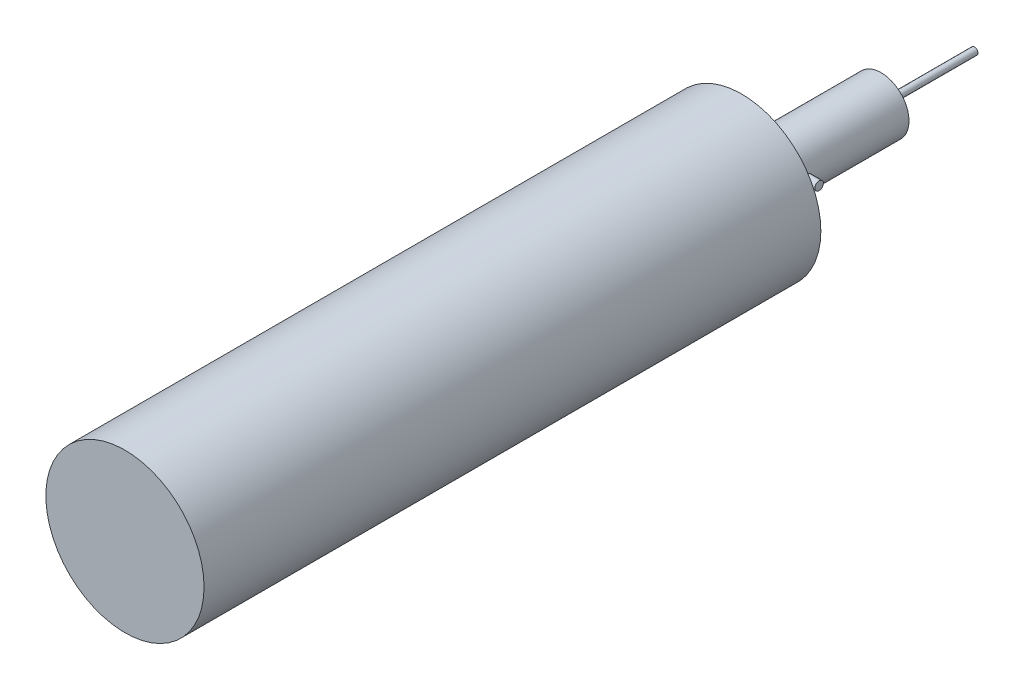
ISO-10303-21;
HEADER;
FILE_DESCRIPTION(('STEP AP214'),'2;1');
FILE_NAME('part.step','',(''),(''),'','','');
FILE_SCHEMA(('AUTOMOTIVE_DESIGN { 1 0 10303 214 1 1 1 1 }'));
ENDSEC;
DATA;
#1=APPLICATION_CONTEXT('core data for automotive mechanical design processes');
#2=APPLICATION_PROTOCOL_DEFINITION('international standard','automotive_design',2000,#1);
#3=PRODUCT_CONTEXT('',#1,'mechanical');
#4=PRODUCT('Part','Part','',(#3));
#5=PRODUCT_RELATED_PRODUCT_CATEGORY('part','',(#4));
#6=PRODUCT_DEFINITION_FORMATION('','',#4);
#7=PRODUCT_DEFINITION_CONTEXT('part definition',#1,'design');
#8=PRODUCT_DEFINITION('design','',#6,#7);
#9=PRODUCT_DEFINITION_SHAPE('','',#8);
#10=(LENGTH_UNIT() NAMED_UNIT(*) SI_UNIT(.MILLI.,.METRE.));
#11=(NAMED_UNIT(*) PLANE_ANGLE_UNIT() SI_UNIT($,.RADIAN.));
#12=(NAMED_UNIT(*) SI_UNIT($,.STERADIAN.) SOLID_ANGLE_UNIT());
#13=UNCERTAINTY_MEASURE_WITH_UNIT(LENGTH_MEASURE(1.E-05),#10,'distance_accuracy_value','');
#14=(GEOMETRIC_REPRESENTATION_CONTEXT(3) GLOBAL_UNCERTAINTY_ASSIGNED_CONTEXT((#13)) GLOBAL_UNIT_ASSIGNED_CONTEXT((#10,
#11,#12)) REPRESENTATION_CONTEXT('',''));
#15=CARTESIAN_POINT('',(0.,0.,0.));
#16=DIRECTION('',(0.,0.,1.));
#17=DIRECTION('',(1.,0.,0.));
#18=AXIS2_PLACEMENT_3D('',#15,#16,#17);
#19=CARTESIAN_POINT('',(0.,0.,-20.));
#20=DIRECTION('',(0.,0.,-1.));
#21=DIRECTION('',(-1.,0.,0.));
#22=AXIS2_PLACEMENT_3D('',#19,#20,#21);
#23=PLANE('',#22);
#24=CARTESIAN_POINT('',(0.,0.,-20.));
#25=DIRECTION('',(0.,0.,-1.));
#26=DIRECTION('',(-1.,0.,0.));
#27=AXIS2_PLACEMENT_3D('',#24,#25,#26);
#28=CIRCLE('',#27,0.5);
#29=CARTESIAN_POINT('',(-0.5,0.,-20.));
#30=VERTEX_POINT('',#29);
#31=EDGE_CURVE('E68',#30,#30,#28,.T.);
#32=ORIENTED_EDGE('',*,*,#31,.F.);
#33=EDGE_LOOP('',(#32));
#34=FACE_BOUND('',#33,.T.);
#35=CARTESIAN_POINT('',(0.,0.,-20.));
#36=DIRECTION('',(0.,0.,-1.));
#37=DIRECTION('',(-1.,0.,0.));
#38=AXIS2_PLACEMENT_3D('',#35,#36,#37);
#39=CIRCLE('',#38,4.);
#40=CARTESIAN_POINT('',(-4.,0.,-20.));
#41=VERTEX_POINT('',#40);
#42=EDGE_CURVE('E54',#41,#41,#39,.T.);
#43=ORIENTED_EDGE('',*,*,#42,.T.);
#44=EDGE_LOOP('',(#43));
#45=FACE_BOUND('',#44,.T.);
#46=ADVANCED_FACE('F30',(#34,#45),#23,.T.);
#47=CARTESIAN_POINT('',(0.,0.,0.));
#48=DIRECTION('',(0.,0.,1.));
#49=DIRECTION('',(1.,0.,0.));
#50=AXIS2_PLACEMENT_3D('',#47,#48,#49);
#51=PLANE('',#50);
#52=CARTESIAN_POINT('',(0.,0.,0.));
#53=DIRECTION('',(0.,0.,-1.));
#54=DIRECTION('',(-1.,0.,0.));
#55=AXIS2_PLACEMENT_3D('',#52,#53,#54);
#56=CIRCLE('',#55,4.);
#57=CARTESIAN_POINT('',(-4.,0.,0.));
#58=VERTEX_POINT('',#57);
#59=EDGE_CURVE('E42',#58,#58,#56,.T.);
#60=ORIENTED_EDGE('',*,*,#59,.F.);
#61=EDGE_LOOP('',(#60));
#62=FACE_BOUND('',#61,.T.);
#63=CARTESIAN_POINT('',(0.,0.,0.));
#64=DIRECTION('',(0.,0.,1.));
#65=DIRECTION('',(1.,0.,0.));
#66=AXIS2_PLACEMENT_3D('',#63,#64,#65);
#67=CIRCLE('',#66,11.35);
#68=CARTESIAN_POINT('',(11.35,0.,0.));
#69=VERTEX_POINT('',#68);
#70=EDGE_CURVE('E51',#69,#69,#67,.T.);
#71=ORIENTED_EDGE('',*,*,#70,.F.);
#72=EDGE_LOOP('',(#71));
#73=FACE_BOUND('',#72,.T.);
#74=ADVANCED_FACE('F77',(#62,#73),#51,.F.);
#75=CARTESIAN_POINT('',(0.,0.,-20.));
#76=DIRECTION('',(0.,0.,1.));
#77=DIRECTION('',(1.,0.,0.));
#78=AXIS2_PLACEMENT_3D('',#75,#76,#77);
#79=CYLINDRICAL_SURFACE('',#78,4.);
#80=ORIENTED_EDGE('',*,*,#42,.F.);
#81=EDGE_LOOP('',(#80));
#82=FACE_BOUND('',#81,.T.);
#83=ORIENTED_EDGE('',*,*,#59,.T.);
#84=EDGE_LOOP('',(#83));
#85=FACE_BOUND('',#84,.T.);
#86=CARTESIAN_POINT('',(4.,0.,-6.11511237279015));
#87=CARTESIAN_POINT('',(3.99999944036138,0.0343339576763094,-6.11511096494933));
#88=CARTESIAN_POINT('',(3.99955331559927,0.0686875803770465,-6.11222801964068));
#89=CARTESIAN_POINT('',(3.99781657665681,0.136433877036393,-6.10077573783102));
#90=CARTESIAN_POINT('',(3.99652515017252,0.169825594382843,-6.0922009315485));
#91=CARTESIAN_POINT('',(3.99324287481401,0.234657912154594,-6.06962780746758));
#92=CARTESIAN_POINT('',(3.99125256420595,0.266099992285163,-6.05563366268142));
#93=CARTESIAN_POINT('',(3.98679221170934,0.326185034686253,-6.02262946448567));
#94=CARTESIAN_POINT('',(3.98432223388301,0.354828369977608,-6.00362008076757));
#95=CARTESIAN_POINT('',(3.9791543994726,0.408742167860347,-5.96095911260234));
#96=CARTESIAN_POINT('',(3.97645500555504,0.433986374426679,-5.93727452920294));
#97=CARTESIAN_POINT('',(3.97114455181371,0.480158732666938,-5.8860064968293));
#98=CARTESIAN_POINT('',(3.96853349718249,0.501086630997466,-5.85842281915986));
#99=CARTESIAN_POINT('',(3.96368044630013,0.538135182523734,-5.79996230951047));
#100=CARTESIAN_POINT('',(3.96144043689396,0.554230308445695,-5.76906912070513));
#101=CARTESIAN_POINT('',(3.95760416549902,0.580993276069253,-5.70497764683955));
#102=CARTESIAN_POINT('',(3.9560078666142,0.591661428842089,-5.67177949402262));
#103=CARTESIAN_POINT('',(3.95365491239252,0.607185815903056,-5.60429709541064));
#104=CARTESIAN_POINT('',(3.95289175411072,0.612087086414738,-5.57002344115495));
#105=CARTESIAN_POINT('',(3.95227176222525,0.616078123574965,-5.50113231494196));
#106=CARTESIAN_POINT('',(3.95241487396157,0.615168240712521,-5.46651486384588));
#107=CARTESIAN_POINT('',(3.95358530774473,0.607599577334941,-5.39823767419148));
#108=CARTESIAN_POINT('',(3.95460490037917,0.600991049811556,-5.36457221335829));
#109=CARTESIAN_POINT('',(3.95740133383931,0.582291398119558,-5.2988337090606));
#110=CARTESIAN_POINT('',(3.95917819708444,0.570200111630102,-5.2667607127733));
#111=CARTESIAN_POINT('',(3.96329746080856,0.540826190755733,-5.20496521025269));
#112=CARTESIAN_POINT('',(3.96564216237215,0.523522361869373,-5.17525293830785));
#113=CARTESIAN_POINT('',(3.97063126530193,0.484229632344895,-5.11913467318219));
#114=CARTESIAN_POINT('',(3.9732756873193,0.462240408784308,-5.09272890808867));
#115=CARTESIAN_POINT('',(3.97860038172766,0.413925681709372,-5.04368204947562));
#116=CARTESIAN_POINT('',(3.98128073859254,0.387556991579183,-5.02108348543359));
#117=CARTESIAN_POINT('',(3.98634948303283,0.331378785716449,-4.98062583908024));
#118=CARTESIAN_POINT('',(3.98873786920888,0.301569253493831,-4.96276677948411));
#119=CARTESIAN_POINT('',(3.99295624766034,0.23931800243145,-4.93229254275767));
#120=CARTESIAN_POINT('',(3.99478587929296,0.206874600611396,-4.91968075053143));
#121=CARTESIAN_POINT('',(3.99767761177419,0.140295882409898,-4.90009656692722));
#122=CARTESIAN_POINT('',(3.99873976718457,0.106160686486638,-4.89312377465477));
#123=CARTESIAN_POINT('',(3.99996962071774,0.0375343043852936,-4.88507231534005));
#124=CARTESIAN_POINT('',(4.00014618856729,0.00305012898917011,-4.88393519759348));
#125=CARTESIAN_POINT('',(3.99960914931405,-0.0656163662373538,-4.88743207022047));
#126=CARTESIAN_POINT('',(3.99889557121784,-0.0997986958672407,-4.89206587254103));
#127=CARTESIAN_POINT('',(3.99666390483501,-0.166713378879138,-4.90692444063789));
#128=CARTESIAN_POINT('',(3.99514992989017,-0.199452226901822,-4.91712062906944));
#129=CARTESIAN_POINT('',(3.991486644996,-0.262755757678132,-4.94278432943469));
#130=CARTESIAN_POINT('',(3.98933730390383,-0.293320333767421,-4.95825209976373));
#131=CARTESIAN_POINT('',(3.98462000830936,-0.35166404553733,-4.99415630859772));
#132=CARTESIAN_POINT('',(3.98204898947969,-0.379420187401964,-5.01462970156018));
#133=CARTESIAN_POINT('',(3.97678376960567,-0.431123527372793,-5.05991267591248));
#134=CARTESIAN_POINT('',(3.97408956102395,-0.455070492011851,-5.08472252289117));
#135=CARTESIAN_POINT('',(3.96885336888563,-0.498689263840812,-5.13823478777761));
#136=CARTESIAN_POINT('',(3.96631292398989,-0.518321820156062,-5.16696937340241));
#137=CARTESIAN_POINT('',(3.96169947083968,-0.552481368395425,-5.22736284965026));
#138=CARTESIAN_POINT('',(3.95962644945646,-0.567008503724382,-5.25902165810402));
#139=CARTESIAN_POINT('',(3.95619378729686,-0.590484465609609,-5.32424945208793));
#140=CARTESIAN_POINT('',(3.95483153916977,-0.599453703423393,-5.35781094815866));
#141=CARTESIAN_POINT('',(3.9529678139154,-0.611624078609512,-5.42598652981106));
#142=CARTESIAN_POINT('',(3.9524662740358,-0.614825636491408,-5.4606005384691));
#143=CARTESIAN_POINT('',(3.95238317444215,-0.615359390162452,-5.52950720558665));
#144=CARTESIAN_POINT('',(3.95279193912676,-0.61275331491618,-5.56379939010872));
#145=CARTESIAN_POINT('',(3.95446232448368,-0.601878321789304,-5.63145150426222));
#146=CARTESIAN_POINT('',(3.95572394350508,-0.593609414870587,-5.66481143569814));
#147=CARTESIAN_POINT('',(3.95895443766111,-0.571665713327421,-5.72963349183802));
#148=CARTESIAN_POINT('',(3.96092271952202,-0.557995452406058,-5.76109718271674));
#149=CARTESIAN_POINT('',(3.96534545137345,-0.525643271784539,-5.82129447251517));
#150=CARTESIAN_POINT('',(3.96779991951193,-0.506961164997014,-5.85002796946514));
#151=CARTESIAN_POINT('',(3.97294948251351,-0.464892195535066,-5.90426248491267));
#152=CARTESIAN_POINT('',(3.97564675922094,-0.441459677667599,-5.9297278864519));
#153=CARTESIAN_POINT('',(3.98095998818411,-0.390651532762378,-5.97638681827618));
#154=CARTESIAN_POINT('',(3.98357592142628,-0.3632749921308,-5.99757935605793));
#155=CARTESIAN_POINT('',(3.98844911735973,-0.305168573917886,-6.0352014374543));
#156=CARTESIAN_POINT('',(3.99070421106605,-0.274420162499573,-6.05160263382725));
#157=CARTESIAN_POINT('',(3.99458042096418,-0.210584326446154,-6.07898286678243));
#158=CARTESIAN_POINT('',(3.99620218794684,-0.177499344327365,-6.08996747238555));
#159=CARTESIAN_POINT('',(3.99826235090752,-0.120225129710788,-6.10373407549457));
#160=CARTESIAN_POINT('',(3.99891059323391,-0.0963879660062686,-6.10799434869642));
#161=CARTESIAN_POINT('',(3.99977961206448,-0.0483704523431402,-6.11368397433121));
#162=CARTESIAN_POINT('',(4.0000003942953,-0.0241901069864718,-6.11511336468919));
#163=CARTESIAN_POINT('',(4.,0.,-6.11511237279015));
#164=B_SPLINE_CURVE_WITH_KNOTS('',3,(#86,#87,#88,#89,#90,#91,#92,#93,#94,#95,#96,#97,#98,#99,
#100,#101,#102,#103,#104,#105,#106,#107,#108,#109,#110,#111,#112,#113,#114,#115,#116,#117,#118,
#119,#120,#121,#122,#123,#124,#125,#126,#127,#128,#129,#130,#131,#132,#133,#134,#135,#136,#137,
#138,#139,#140,#141,#142,#143,#144,#145,#146,#147,#148,#149,#150,#151,#152,#153,#154,#155,#156,
#157,#158,#159,#160,#161,#162,#163),.UNSPECIFIED.,.T.,.F.,(4,2,2,2,2,2,2,2,2,2,2,2,2,2,2,2,2,2,
2,2,2,2,2,2,2,2,2,2,2,2,2,2,2,2,2,2,2,2,4),(0.,0.10291347362186,0.20592598879513,
0.308859339240696,0.411778951810435,0.515452799428105,0.61913273039605,0.723351048175094,
0.827563391541814,0.930956374442948,1.03434312144569,1.13682737800104,1.23931466887132,
1.34222443665096,1.4451412993786,1.54914091410703,1.6531410272694,1.75720812513314,
1.86126782388448,1.96428318723596,2.06729519378457,2.16978288223302,2.2722755950085,
2.37554911456678,2.47882896139441,2.58301272265854,2.68719355729811,2.79098948667665,
2.89477784820331,2.99746831698243,3.10015858697792,3.20276284492395,3.305370933521,
3.409016381556,3.51268587675113,3.61695684043507,3.72112037413557,3.79362938439351,
3.86613742324917),.UNSPECIFIED.);
#165=CARTESIAN_POINT('',(4.,0.,-6.11511237279015));
#166=VERTEX_POINT('',#165);
#167=EDGE_CURVE('E10',#166,#166,#164,.T.);
#168=ORIENTED_EDGE('',*,*,#167,.F.);
#169=EDGE_LOOP('',(#168));
#170=FACE_BOUND('',#169,.T.);
#171=ADVANCED_FACE('F82',(#82,#85,#170),#79,.T.);
#172=CARTESIAN_POINT('',(0.,0.,88.5));
#173=DIRECTION('',(0.,0.,-1.));
#174=DIRECTION('',(-1.,0.,0.));
#175=AXIS2_PLACEMENT_3D('',#172,#173,#174);
#176=CYLINDRICAL_SURFACE('',#175,11.35);
#177=CARTESIAN_POINT('',(0.,0.,88.5));
#178=DIRECTION('',(0.,0.,1.));
#179=DIRECTION('',(1.,0.,0.));
#180=AXIS2_PLACEMENT_3D('',#177,#178,#179);
#181=CIRCLE('',#180,11.35);
#182=CARTESIAN_POINT('',(11.35,0.,88.5));
#183=VERTEX_POINT('',#182);
#184=EDGE_CURVE('E46',#183,#183,#181,.T.);
#185=ORIENTED_EDGE('',*,*,#184,.F.);
#186=EDGE_LOOP('',(#185));
#187=FACE_BOUND('',#186,.T.);
#188=ORIENTED_EDGE('',*,*,#70,.T.);
#189=EDGE_LOOP('',(#188));
#190=FACE_BOUND('',#189,.T.);
#191=ADVANCED_FACE('F32',(#187,#190),#176,.T.);
#192=CARTESIAN_POINT('',(0.,0.,88.5));
#193=DIRECTION('',(0.,0.,1.));
#194=DIRECTION('',(1.,0.,0.));
#195=AXIS2_PLACEMENT_3D('',#192,#193,#194);
#196=PLANE('',#195);
#197=ORIENTED_EDGE('',*,*,#184,.T.);
#198=EDGE_LOOP('',(#197));
#199=FACE_BOUND('',#198,.T.);
#200=ADVANCED_FACE('F91',(#199),#196,.T.);
#201=CARTESIAN_POINT('',(5.6,0.,-5.5));
#202=DIRECTION('',(-1.,0.,0.));
#203=DIRECTION('',(0.,0.,1.));
#204=AXIS2_PLACEMENT_3D('',#201,#202,#203);
#205=CYLINDRICAL_SURFACE('',#204,0.615112372790145);
#206=CARTESIAN_POINT('',(5.6,0.,-5.5));
#207=DIRECTION('',(1.,0.,0.));
#208=DIRECTION('',(0.,0.,-1.));
#209=AXIS2_PLACEMENT_3D('',#206,#207,#208);
#210=CIRCLE('',#209,0.615112372790145);
#211=CARTESIAN_POINT('',(5.6,0.,-6.11511237279015));
#212=VERTEX_POINT('',#211);
#213=EDGE_CURVE('E60',#212,#212,#210,.T.);
#214=ORIENTED_EDGE('',*,*,#213,.F.);
#215=EDGE_LOOP('',(#214));
#216=FACE_BOUND('',#215,.T.);
#217=ORIENTED_EDGE('',*,*,#167,.T.);
#218=EDGE_LOOP('',(#217));
#219=FACE_BOUND('',#218,.T.);
#220=ADVANCED_FACE('F84',(#216,#219),#205,.T.);
#221=CARTESIAN_POINT('',(5.6,0.,-5.5));
#222=DIRECTION('',(1.,0.,0.));
#223=DIRECTION('',(0.,0.,-1.));
#224=AXIS2_PLACEMENT_3D('',#221,#222,#223);
#225=PLANE('',#224);
#226=ORIENTED_EDGE('',*,*,#213,.T.);
#227=EDGE_LOOP('',(#226));
#228=FACE_BOUND('',#227,.T.);
#229=ADVANCED_FACE('F98',(#228),#225,.T.);
#230=CARTESIAN_POINT('',(0.,0.,-33.4));
#231=DIRECTION('',(0.,0.,1.));
#232=DIRECTION('',(1.,0.,0.));
#233=AXIS2_PLACEMENT_3D('',#230,#231,#232);
#234=CYLINDRICAL_SURFACE('',#233,0.5);
#235=CARTESIAN_POINT('',(0.,0.,-33.4));
#236=DIRECTION('',(0.,0.,-1.));
#237=DIRECTION('',(-1.,0.,0.));
#238=AXIS2_PLACEMENT_3D('',#235,#236,#237);
#239=CIRCLE('',#238,0.5);
#240=CARTESIAN_POINT('',(-0.5,0.,-33.4));
#241=VERTEX_POINT('',#240);
#242=EDGE_CURVE('E64',#241,#241,#239,.T.);
#243=ORIENTED_EDGE('',*,*,#242,.F.);
#244=EDGE_LOOP('',(#243));
#245=FACE_BOUND('',#244,.T.);
#246=ORIENTED_EDGE('',*,*,#31,.T.);
#247=EDGE_LOOP('',(#246));
#248=FACE_BOUND('',#247,.T.);
#249=ADVANCED_FACE('F74',(#245,#248),#234,.T.);
#250=CARTESIAN_POINT('',(0.,0.,-33.4));
#251=DIRECTION('',(0.,0.,-1.));
#252=DIRECTION('',(-1.,0.,0.));
#253=AXIS2_PLACEMENT_3D('',#250,#251,#252);
#254=PLANE('',#253);
#255=ORIENTED_EDGE('',*,*,#242,.T.);
#256=EDGE_LOOP('',(#255));
#257=FACE_BOUND('',#256,.T.);
#258=ADVANCED_FACE('F161',(#257),#254,.T.);
#259=CLOSED_SHELL('',(#46,#74,#171,#191,#200,#220,#229,#249,#258));
#260=MANIFOLD_SOLID_BREP('B2',#259);
#261=ADVANCED_BREP_SHAPE_REPRESENTATION('',(#18,#260),#14);
#262=SHAPE_DEFINITION_REPRESENTATION(#9,#261);
ENDSEC;
END-ISO-10303-21;
